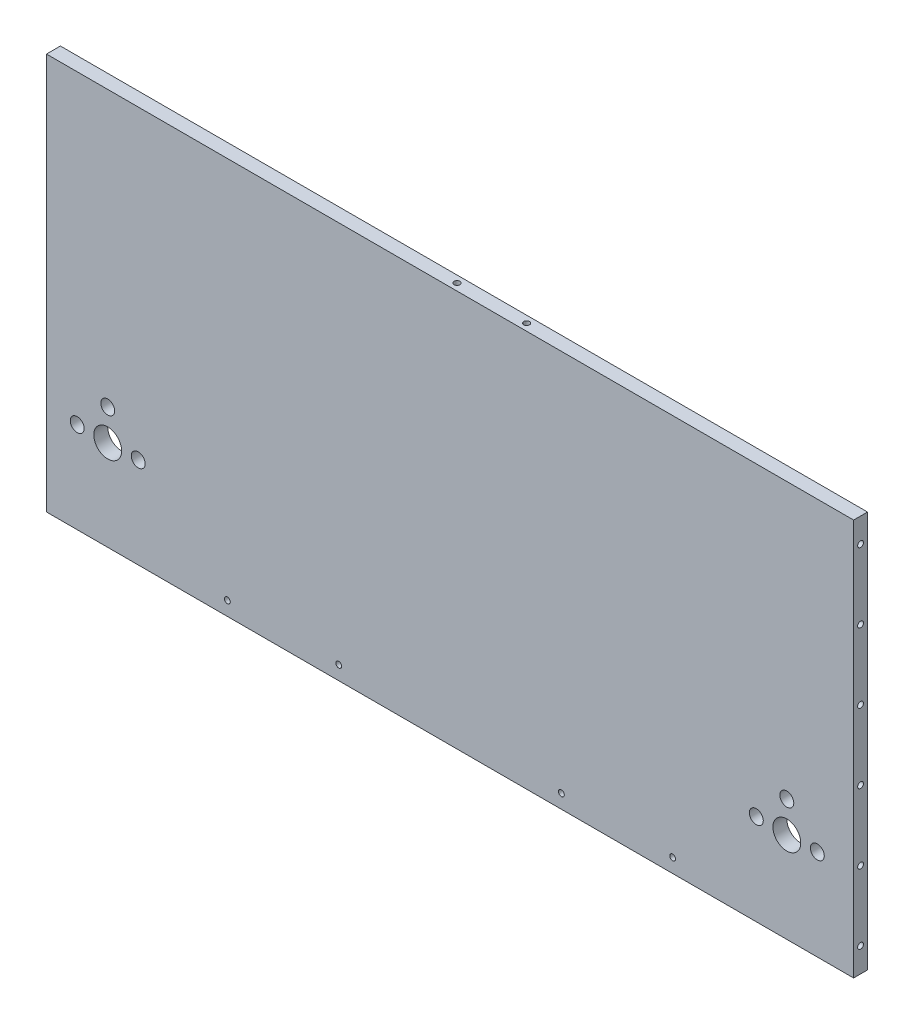
ISO-10303-21;
HEADER;
FILE_DESCRIPTION(('STEP AP214'),'2;1');
FILE_NAME('part.step','',(''),(''),'','','');
FILE_SCHEMA(('AUTOMOTIVE_DESIGN { 1 0 10303 214 1 1 1 1 }'));
ENDSEC;
DATA;
#1=APPLICATION_CONTEXT('core data for automotive mechanical design processes');
#2=APPLICATION_PROTOCOL_DEFINITION('international standard','automotive_design',2000,#1);
#3=PRODUCT_CONTEXT('',#1,'mechanical');
#4=PRODUCT('Part','Part','',(#3));
#5=PRODUCT_RELATED_PRODUCT_CATEGORY('part','',(#4));
#6=PRODUCT_DEFINITION_FORMATION('','',#4);
#7=PRODUCT_DEFINITION_CONTEXT('part definition',#1,'design');
#8=PRODUCT_DEFINITION('design','',#6,#7);
#9=PRODUCT_DEFINITION_SHAPE('','',#8);
#10=(LENGTH_UNIT() NAMED_UNIT(*) SI_UNIT(.MILLI.,.METRE.));
#11=(NAMED_UNIT(*) PLANE_ANGLE_UNIT() SI_UNIT($,.RADIAN.));
#12=(NAMED_UNIT(*) SI_UNIT($,.STERADIAN.) SOLID_ANGLE_UNIT());
#13=UNCERTAINTY_MEASURE_WITH_UNIT(LENGTH_MEASURE(1.E-05),#10,'distance_accuracy_value','');
#14=(GEOMETRIC_REPRESENTATION_CONTEXT(3) GLOBAL_UNCERTAINTY_ASSIGNED_CONTEXT((#13)) GLOBAL_UNIT_ASSIGNED_CONTEXT((#10,
#11,#12)) REPRESENTATION_CONTEXT('',''));
#15=CARTESIAN_POINT('',(0.,0.,0.));
#16=DIRECTION('',(0.,0.,1.));
#17=DIRECTION('',(1.,0.,0.));
#18=AXIS2_PLACEMENT_3D('',#15,#16,#17);
#19=CARTESIAN_POINT('',(290.,142.5,10.));
#20=DIRECTION('',(-1.,0.,0.));
#21=DIRECTION('',(0.,0.,1.));
#22=AXIS2_PLACEMENT_3D('',#19,#20,#21);
#23=PLANE('',#22);
#24=CARTESIAN_POINT('',(290.,125.,5.));
#25=DIRECTION('',(1.,0.,0.));
#26=DIRECTION('',(0.,0.,-1.));
#27=AXIS2_PLACEMENT_3D('',#24,#25,#26);
#28=CIRCLE('',#27,2.1);
#29=CARTESIAN_POINT('',(290.,125.,2.9));
#30=VERTEX_POINT('',#29);
#31=EDGE_CURVE('E137',#30,#30,#28,.T.);
#32=ORIENTED_EDGE('',*,*,#31,.F.);
#33=EDGE_LOOP('',(#32));
#34=FACE_BOUND('',#33,.T.);
#35=CARTESIAN_POINT('',(290.,75.,5.));
#36=DIRECTION('',(1.,0.,0.));
#37=DIRECTION('',(0.,0.,-1.));
#38=AXIS2_PLACEMENT_3D('',#35,#36,#37);
#39=CIRCLE('',#38,2.1);
#40=CARTESIAN_POINT('',(290.,75.,2.9));
#41=VERTEX_POINT('',#40);
#42=EDGE_CURVE('E136',#41,#41,#39,.T.);
#43=ORIENTED_EDGE('',*,*,#42,.F.);
#44=EDGE_LOOP('',(#43));
#45=FACE_BOUND('',#44,.T.);
#46=CARTESIAN_POINT('',(290.,25.,5.));
#47=DIRECTION('',(1.,0.,0.));
#48=DIRECTION('',(0.,0.,-1.));
#49=AXIS2_PLACEMENT_3D('',#46,#47,#48);
#50=CIRCLE('',#49,2.1);
#51=CARTESIAN_POINT('',(290.,25.,2.9));
#52=VERTEX_POINT('',#51);
#53=EDGE_CURVE('E149',#52,#52,#50,.T.);
#54=ORIENTED_EDGE('',*,*,#53,.F.);
#55=EDGE_LOOP('',(#54));
#56=FACE_BOUND('',#55,.T.);
#57=CARTESIAN_POINT('',(290.,-25.0000000000001,5.));
#58=DIRECTION('',(1.,0.,0.));
#59=DIRECTION('',(0.,0.,-1.));
#60=AXIS2_PLACEMENT_3D('',#57,#58,#59);
#61=CIRCLE('',#60,2.1);
#62=CARTESIAN_POINT('',(290.,-25.0000000000001,2.9));
#63=VERTEX_POINT('',#62);
#64=EDGE_CURVE('E155',#63,#63,#61,.T.);
#65=ORIENTED_EDGE('',*,*,#64,.F.);
#66=EDGE_LOOP('',(#65));
#67=FACE_BOUND('',#66,.T.);
#68=CARTESIAN_POINT('',(290.,-75.0000000000001,5.));
#69=DIRECTION('',(1.,0.,0.));
#70=DIRECTION('',(0.,0.,-1.));
#71=AXIS2_PLACEMENT_3D('',#68,#69,#70);
#72=CIRCLE('',#71,2.1);
#73=CARTESIAN_POINT('',(290.,-75.0000000000001,2.9));
#74=VERTEX_POINT('',#73);
#75=EDGE_CURVE('E161',#74,#74,#72,.T.);
#76=ORIENTED_EDGE('',*,*,#75,.F.);
#77=EDGE_LOOP('',(#76));
#78=FACE_BOUND('',#77,.T.);
#79=CARTESIAN_POINT('',(290.,-125.,5.));
#80=DIRECTION('',(1.,0.,0.));
#81=DIRECTION('',(0.,0.,-1.));
#82=AXIS2_PLACEMENT_3D('',#79,#80,#81);
#83=CIRCLE('',#82,2.1);
#84=CARTESIAN_POINT('',(290.,-125.,2.9));
#85=VERTEX_POINT('',#84);
#86=EDGE_CURVE('E167',#85,#85,#83,.T.);
#87=ORIENTED_EDGE('',*,*,#86,.F.);
#88=EDGE_LOOP('',(#87));
#89=FACE_BOUND('',#88,.T.);
#90=DIRECTION('',(0.,1.,0.));
#91=VECTOR('',#90,1.);
#92=CARTESIAN_POINT('',(290.,142.5,0.));
#93=LINE('',#92,#91);
#94=CARTESIAN_POINT('',(290.,-142.5,0.));
#95=VERTEX_POINT('',#94);
#96=CARTESIAN_POINT('',(290.,142.5,0.));
#97=VERTEX_POINT('',#96);
#98=EDGE_CURVE('E209',#95,#97,#93,.T.);
#99=ORIENTED_EDGE('',*,*,#98,.T.);
#100=DIRECTION('',(0.,0.,-1.));
#101=VECTOR('',#100,1.);
#102=CARTESIAN_POINT('',(290.,142.5,10.));
#103=LINE('',#102,#101);
#104=CARTESIAN_POINT('',(290.,142.5,10.));
#105=VERTEX_POINT('',#104);
#106=EDGE_CURVE('E11',#105,#97,#103,.T.);
#107=ORIENTED_EDGE('',*,*,#106,.F.);
#108=DIRECTION('',(0.,1.,0.));
#109=VECTOR('',#108,1.);
#110=CARTESIAN_POINT('',(290.,142.5,10.));
#111=LINE('',#110,#109);
#112=CARTESIAN_POINT('',(290.,-142.5,10.));
#113=VERTEX_POINT('',#112);
#114=EDGE_CURVE('E210',#113,#105,#111,.T.);
#115=ORIENTED_EDGE('',*,*,#114,.F.);
#116=DIRECTION('',(0.,0.,-1.));
#117=VECTOR('',#116,1.);
#118=CARTESIAN_POINT('',(290.,-142.5,10.));
#119=LINE('',#118,#117);
#120=EDGE_CURVE('E216',#113,#95,#119,.T.);
#121=ORIENTED_EDGE('',*,*,#120,.T.);
#122=EDGE_LOOP('',(#99,#107,#115,#121));
#123=FACE_BOUND('',#122,.T.);
#124=ADVANCED_FACE('F42',(#34,#45,#56,#67,#78,#89,#123),#23,.F.);
#125=CARTESIAN_POINT('',(-290.,142.5,10.));
#126=DIRECTION('',(0.,-1.,0.));
#127=DIRECTION('',(0.,0.,-1.));
#128=AXIS2_PLACEMENT_3D('',#125,#126,#127);
#129=PLANE('',#128);
#130=CARTESIAN_POINT('',(0.,142.5,5.));
#131=DIRECTION('',(0.,-1.,0.));
#132=DIRECTION('',(0.,0.,-1.));
#133=AXIS2_PLACEMENT_3D('',#130,#131,#132);
#134=CIRCLE('',#133,2.09999999999996);
#135=CARTESIAN_POINT('',(0.,142.5,2.90000000000004));
#136=VERTEX_POINT('',#135);
#137=EDGE_CURVE('E391',#136,#136,#134,.T.);
#138=ORIENTED_EDGE('',*,*,#137,.T.);
#139=EDGE_LOOP('',(#138));
#140=FACE_BOUND('',#139,.T.);
#141=CARTESIAN_POINT('',(50.,142.5,5.0000000000007));
#142=DIRECTION('',(0.,-1.,0.));
#143=DIRECTION('',(0.,0.,-1.));
#144=AXIS2_PLACEMENT_3D('',#141,#142,#143);
#145=CIRCLE('',#144,2.09999999999996);
#146=CARTESIAN_POINT('',(50.,142.5,2.90000000000074));
#147=VERTEX_POINT('',#146);
#148=EDGE_CURVE('E143',#147,#147,#145,.T.);
#149=ORIENTED_EDGE('',*,*,#148,.T.);
#150=EDGE_LOOP('',(#149));
#151=FACE_BOUND('',#150,.T.);
#152=DIRECTION('',(-1.,0.,0.));
#153=VECTOR('',#152,1.);
#154=CARTESIAN_POINT('',(-290.,142.5,0.));
#155=LINE('',#154,#153);
#156=CARTESIAN_POINT('',(-290.,142.5,0.));
#157=VERTEX_POINT('',#156);
#158=EDGE_CURVE('E219',#97,#157,#155,.T.);
#159=ORIENTED_EDGE('',*,*,#158,.T.);
#160=DIRECTION('',(0.,0.,-1.));
#161=VECTOR('',#160,1.);
#162=CARTESIAN_POINT('',(-290.,142.5,10.));
#163=LINE('',#162,#161);
#164=CARTESIAN_POINT('',(-290.,142.5,10.));
#165=VERTEX_POINT('',#164);
#166=EDGE_CURVE('E50',#165,#157,#163,.T.);
#167=ORIENTED_EDGE('',*,*,#166,.F.);
#168=DIRECTION('',(-1.,0.,0.));
#169=VECTOR('',#168,1.);
#170=CARTESIAN_POINT('',(-290.,142.5,10.));
#171=LINE('',#170,#169);
#172=EDGE_CURVE('E89',#105,#165,#171,.T.);
#173=ORIENTED_EDGE('',*,*,#172,.F.);
#174=ORIENTED_EDGE('',*,*,#106,.T.);
#175=EDGE_LOOP('',(#159,#167,#173,#174));
#176=FACE_BOUND('',#175,.T.);
#177=ADVANCED_FACE('F245',(#140,#151,#176),#129,.F.);
#178=CARTESIAN_POINT('',(-290.,142.5,10.));
#179=DIRECTION('',(1.,0.,0.));
#180=DIRECTION('',(0.,0.,-1.));
#181=AXIS2_PLACEMENT_3D('',#178,#179,#180);
#182=PLANE('',#181);
#183=CARTESIAN_POINT('',(-290.,125.,5.));
#184=DIRECTION('',(-1.,0.,0.));
#185=DIRECTION('',(0.,0.,1.));
#186=AXIS2_PLACEMENT_3D('',#183,#184,#185);
#187=CIRCLE('',#186,2.1);
#188=CARTESIAN_POINT('',(-290.,125.,7.1));
#189=VERTEX_POINT('',#188);
#190=EDGE_CURVE('E173',#189,#189,#187,.T.);
#191=ORIENTED_EDGE('',*,*,#190,.F.);
#192=EDGE_LOOP('',(#191));
#193=FACE_BOUND('',#192,.T.);
#194=CARTESIAN_POINT('',(-290.,75.,5.));
#195=DIRECTION('',(-1.,0.,0.));
#196=DIRECTION('',(0.,0.,1.));
#197=AXIS2_PLACEMENT_3D('',#194,#195,#196);
#198=CIRCLE('',#197,2.1);
#199=CARTESIAN_POINT('',(-290.,75.,7.1));
#200=VERTEX_POINT('',#199);
#201=EDGE_CURVE('E179',#200,#200,#198,.T.);
#202=ORIENTED_EDGE('',*,*,#201,.F.);
#203=EDGE_LOOP('',(#202));
#204=FACE_BOUND('',#203,.T.);
#205=CARTESIAN_POINT('',(-290.,25.,5.));
#206=DIRECTION('',(-1.,0.,0.));
#207=DIRECTION('',(0.,0.,1.));
#208=AXIS2_PLACEMENT_3D('',#205,#206,#207);
#209=CIRCLE('',#208,2.1);
#210=CARTESIAN_POINT('',(-290.,25.,7.1));
#211=VERTEX_POINT('',#210);
#212=EDGE_CURVE('E185',#211,#211,#209,.T.);
#213=ORIENTED_EDGE('',*,*,#212,.F.);
#214=EDGE_LOOP('',(#213));
#215=FACE_BOUND('',#214,.T.);
#216=CARTESIAN_POINT('',(-290.,-25.0000000000001,5.));
#217=DIRECTION('',(-1.,0.,0.));
#218=DIRECTION('',(0.,0.,1.));
#219=AXIS2_PLACEMENT_3D('',#216,#217,#218);
#220=CIRCLE('',#219,2.1);
#221=CARTESIAN_POINT('',(-290.,-25.0000000000001,7.1));
#222=VERTEX_POINT('',#221);
#223=EDGE_CURVE('E191',#222,#222,#220,.T.);
#224=ORIENTED_EDGE('',*,*,#223,.F.);
#225=EDGE_LOOP('',(#224));
#226=FACE_BOUND('',#225,.T.);
#227=CARTESIAN_POINT('',(-290.,-75.0000000000001,5.));
#228=DIRECTION('',(-1.,0.,0.));
#229=DIRECTION('',(0.,0.,1.));
#230=AXIS2_PLACEMENT_3D('',#227,#228,#229);
#231=CIRCLE('',#230,2.1);
#232=CARTESIAN_POINT('',(-290.,-75.0000000000001,7.1));
#233=VERTEX_POINT('',#232);
#234=EDGE_CURVE('E197',#233,#233,#231,.T.);
#235=ORIENTED_EDGE('',*,*,#234,.F.);
#236=EDGE_LOOP('',(#235));
#237=FACE_BOUND('',#236,.T.);
#238=CARTESIAN_POINT('',(-290.,-125.,5.));
#239=DIRECTION('',(-1.,0.,0.));
#240=DIRECTION('',(0.,0.,1.));
#241=AXIS2_PLACEMENT_3D('',#238,#239,#240);
#242=CIRCLE('',#241,2.1);
#243=CARTESIAN_POINT('',(-290.,-125.,7.1));
#244=VERTEX_POINT('',#243);
#245=EDGE_CURVE('E203',#244,#244,#242,.T.);
#246=ORIENTED_EDGE('',*,*,#245,.F.);
#247=EDGE_LOOP('',(#246));
#248=FACE_BOUND('',#247,.T.);
#249=DIRECTION('',(0.,-1.,0.));
#250=VECTOR('',#249,1.);
#251=CARTESIAN_POINT('',(-290.,142.5,0.));
#252=LINE('',#251,#250);
#253=CARTESIAN_POINT('',(-290.,-142.5,0.));
#254=VERTEX_POINT('',#253);
#255=EDGE_CURVE('E76',#157,#254,#252,.T.);
#256=ORIENTED_EDGE('',*,*,#255,.T.);
#257=DIRECTION('',(0.,0.,-1.));
#258=VECTOR('',#257,1.);
#259=CARTESIAN_POINT('',(-290.,-142.5,10.));
#260=LINE('',#259,#258);
#261=CARTESIAN_POINT('',(-290.,-142.5,10.));
#262=VERTEX_POINT('',#261);
#263=EDGE_CURVE('E224',#262,#254,#260,.T.);
#264=ORIENTED_EDGE('',*,*,#263,.F.);
#265=DIRECTION('',(0.,-1.,0.));
#266=VECTOR('',#265,1.);
#267=CARTESIAN_POINT('',(-290.,142.5,10.));
#268=LINE('',#267,#266);
#269=EDGE_CURVE('E213',#165,#262,#268,.T.);
#270=ORIENTED_EDGE('',*,*,#269,.F.);
#271=ORIENTED_EDGE('',*,*,#166,.T.);
#272=EDGE_LOOP('',(#256,#264,#270,#271));
#273=FACE_BOUND('',#272,.T.);
#274=ADVANCED_FACE('F226',(#193,#204,#215,#226,#237,#248,#273),#182,.F.);
#275=CARTESIAN_POINT('',(-290.,-142.5,10.));
#276=DIRECTION('',(0.,1.,0.));
#277=DIRECTION('',(0.,0.,1.));
#278=AXIS2_PLACEMENT_3D('',#275,#276,#277);
#279=PLANE('',#278);
#280=CARTESIAN_POINT('',(0.,-142.5,5.));
#281=DIRECTION('',(0.,-1.,0.));
#282=DIRECTION('',(0.,0.,-1.));
#283=AXIS2_PLACEMENT_3D('',#280,#281,#282);
#284=CIRCLE('',#283,2.09999999999999);
#285=CARTESIAN_POINT('',(0.,-142.5,2.90000000000001));
#286=VERTEX_POINT('',#285);
#287=EDGE_CURVE('E387',#286,#286,#284,.T.);
#288=ORIENTED_EDGE('',*,*,#287,.F.);
#289=EDGE_LOOP('',(#288));
#290=FACE_BOUND('',#289,.T.);
#291=CARTESIAN_POINT('',(50.,-142.5,5.0000000000007));
#292=DIRECTION('',(0.,-1.,0.));
#293=DIRECTION('',(0.,0.,-1.));
#294=AXIS2_PLACEMENT_3D('',#291,#292,#293);
#295=CIRCLE('',#294,2.09999999999999);
#296=CARTESIAN_POINT('',(50.,-142.5,2.90000000000071));
#297=VERTEX_POINT('',#296);
#298=EDGE_CURVE('E399',#297,#297,#295,.T.);
#299=ORIENTED_EDGE('',*,*,#298,.F.);
#300=EDGE_LOOP('',(#299));
#301=FACE_BOUND('',#300,.T.);
#302=DIRECTION('',(1.,0.,0.));
#303=VECTOR('',#302,1.);
#304=CARTESIAN_POINT('',(-290.,-142.5,0.));
#305=LINE('',#304,#303);
#306=EDGE_CURVE('E82',#254,#95,#305,.T.);
#307=ORIENTED_EDGE('',*,*,#306,.T.);
#308=ORIENTED_EDGE('',*,*,#120,.F.);
#309=DIRECTION('',(1.,0.,0.));
#310=VECTOR('',#309,1.);
#311=CARTESIAN_POINT('',(-290.,-142.5,10.));
#312=LINE('',#311,#310);
#313=EDGE_CURVE('E58',#262,#113,#312,.T.);
#314=ORIENTED_EDGE('',*,*,#313,.F.);
#315=ORIENTED_EDGE('',*,*,#263,.T.);
#316=EDGE_LOOP('',(#307,#308,#314,#315));
#317=FACE_BOUND('',#316,.T.);
#318=ADVANCED_FACE('F233',(#290,#301,#317),#279,.F.);
#319=CARTESIAN_POINT('',(0.,0.,10.));
#320=DIRECTION('',(0.,0.,1.));
#321=DIRECTION('',(1.,0.,0.));
#322=AXIS2_PLACEMENT_3D('',#319,#320,#321);
#323=PLANE('',#322);
#324=CARTESIAN_POINT('',(242.,-77.5,10.));
#325=DIRECTION('',(0.,0.,-1.));
#326=DIRECTION('',(-1.,0.,0.));
#327=AXIS2_PLACEMENT_3D('',#324,#325,#326);
#328=CIRCLE('',#327,10.);
#329=CARTESIAN_POINT('',(232.,-77.5,10.));
#330=VERTEX_POINT('',#329);
#331=EDGE_CURVE('E928',#330,#330,#328,.T.);
#332=ORIENTED_EDGE('',*,*,#331,.T.);
#333=EDGE_LOOP('',(#332));
#334=FACE_BOUND('',#333,.T.);
#335=CARTESIAN_POINT('',(-246.,-77.5,10.));
#336=DIRECTION('',(0.,0.,1.));
#337=DIRECTION('',(1.,0.,0.));
#338=AXIS2_PLACEMENT_3D('',#335,#336,#337);
#339=CIRCLE('',#338,10.);
#340=CARTESIAN_POINT('',(-236.,-77.5,10.));
#341=VERTEX_POINT('',#340);
#342=EDGE_CURVE('E930',#341,#341,#339,.T.);
#343=ORIENTED_EDGE('',*,*,#342,.F.);
#344=EDGE_LOOP('',(#343));
#345=FACE_BOUND('',#344,.T.);
#346=CARTESIAN_POINT('',(263.92,-77.07,10.));
#347=DIRECTION('',(0.,0.,-1.));
#348=DIRECTION('',(-1.,0.,0.));
#349=AXIS2_PLACEMENT_3D('',#346,#347,#348);
#350=CIRCLE('',#349,4.99999999999999);
#351=CARTESIAN_POINT('',(258.92,-77.07,10.));
#352=VERTEX_POINT('',#351);
#353=EDGE_CURVE('E938',#352,#352,#350,.T.);
#354=ORIENTED_EDGE('',*,*,#353,.T.);
#355=EDGE_LOOP('',(#354));
#356=FACE_BOUND('',#355,.T.);
#357=CARTESIAN_POINT('',(220.08,-77.07,10.));
#358=DIRECTION('',(0.,0.,-1.));
#359=DIRECTION('',(-1.,0.,0.));
#360=AXIS2_PLACEMENT_3D('',#357,#358,#359);
#361=CIRCLE('',#360,4.99999999999999);
#362=CARTESIAN_POINT('',(215.08,-77.07,10.));
#363=VERTEX_POINT('',#362);
#364=EDGE_CURVE('E942',#363,#363,#361,.T.);
#365=ORIENTED_EDGE('',*,*,#364,.T.);
#366=EDGE_LOOP('',(#365));
#367=FACE_BOUND('',#366,.T.);
#368=CARTESIAN_POINT('',(242.,-55.15,10.));
#369=DIRECTION('',(0.,0.,-1.));
#370=DIRECTION('',(-1.,0.,0.));
#371=AXIS2_PLACEMENT_3D('',#368,#369,#370);
#372=CIRCLE('',#371,4.99999999999999);
#373=CARTESIAN_POINT('',(237.,-55.15,10.));
#374=VERTEX_POINT('',#373);
#375=EDGE_CURVE('E934',#374,#374,#372,.T.);
#376=ORIENTED_EDGE('',*,*,#375,.T.);
#377=EDGE_LOOP('',(#376));
#378=FACE_BOUND('',#377,.T.);
#379=CARTESIAN_POINT('',(-267.92,-77.07,10.));
#380=DIRECTION('',(0.,0.,1.));
#381=DIRECTION('',(1.,0.,0.));
#382=AXIS2_PLACEMENT_3D('',#379,#380,#381);
#383=CIRCLE('',#382,4.99999999999999);
#384=CARTESIAN_POINT('',(-262.92,-77.07,10.));
#385=VERTEX_POINT('',#384);
#386=EDGE_CURVE('E950',#385,#385,#383,.T.);
#387=ORIENTED_EDGE('',*,*,#386,.F.);
#388=EDGE_LOOP('',(#387));
#389=FACE_BOUND('',#388,.T.);
#390=CARTESIAN_POINT('',(-224.08,-77.07,10.));
#391=DIRECTION('',(0.,0.,1.));
#392=DIRECTION('',(1.,0.,0.));
#393=AXIS2_PLACEMENT_3D('',#390,#391,#392);
#394=CIRCLE('',#393,4.99999999999999);
#395=CARTESIAN_POINT('',(-219.08,-77.07,10.));
#396=VERTEX_POINT('',#395);
#397=EDGE_CURVE('E953',#396,#396,#394,.T.);
#398=ORIENTED_EDGE('',*,*,#397,.F.);
#399=EDGE_LOOP('',(#398));
#400=FACE_BOUND('',#399,.T.);
#401=CARTESIAN_POINT('',(-246.,-55.15,10.));
#402=DIRECTION('',(0.,0.,1.));
#403=DIRECTION('',(1.,0.,0.));
#404=AXIS2_PLACEMENT_3D('',#401,#402,#403);
#405=CIRCLE('',#404,4.99999999999999);
#406=CARTESIAN_POINT('',(-241.,-55.15,10.));
#407=VERTEX_POINT('',#406);
#408=EDGE_CURVE('E957',#407,#407,#405,.T.);
#409=ORIENTED_EDGE('',*,*,#408,.F.);
#410=EDGE_LOOP('',(#409));
#411=FACE_BOUND('',#410,.T.);
#412=CARTESIAN_POINT('',(-160.,-132.5,10.));
#413=DIRECTION('',(0.,0.,1.));
#414=DIRECTION('',(1.,0.,0.));
#415=AXIS2_PLACEMENT_3D('',#412,#413,#414);
#416=CIRCLE('',#415,2.09999999999999);
#417=CARTESIAN_POINT('',(-157.9,-132.5,10.));
#418=VERTEX_POINT('',#417);
#419=EDGE_CURVE('E949',#418,#418,#416,.T.);
#420=ORIENTED_EDGE('',*,*,#419,.F.);
#421=EDGE_LOOP('',(#420));
#422=FACE_BOUND('',#421,.T.);
#423=CARTESIAN_POINT('',(-80.,-132.5,10.));
#424=DIRECTION('',(0.,0.,1.));
#425=DIRECTION('',(1.,0.,0.));
#426=AXIS2_PLACEMENT_3D('',#423,#424,#425);
#427=CIRCLE('',#426,2.09999999999999);
#428=CARTESIAN_POINT('',(-77.9,-132.5,10.));
#429=VERTEX_POINT('',#428);
#430=EDGE_CURVE('E964',#429,#429,#427,.T.);
#431=ORIENTED_EDGE('',*,*,#430,.F.);
#432=EDGE_LOOP('',(#431));
#433=FACE_BOUND('',#432,.T.);
#434=CARTESIAN_POINT('',(80.,-132.5,10.));
#435=DIRECTION('',(0.,0.,1.));
#436=DIRECTION('',(1.,0.,0.));
#437=AXIS2_PLACEMENT_3D('',#434,#435,#436);
#438=CIRCLE('',#437,2.09999999999999);
#439=CARTESIAN_POINT('',(82.1,-132.5,10.));
#440=VERTEX_POINT('',#439);
#441=EDGE_CURVE('E968',#440,#440,#438,.T.);
#442=ORIENTED_EDGE('',*,*,#441,.F.);
#443=EDGE_LOOP('',(#442));
#444=FACE_BOUND('',#443,.T.);
#445=CARTESIAN_POINT('',(160.,-132.5,10.));
#446=DIRECTION('',(0.,0.,1.));
#447=DIRECTION('',(1.,0.,0.));
#448=AXIS2_PLACEMENT_3D('',#445,#446,#447);
#449=CIRCLE('',#448,2.09999999999999);
#450=CARTESIAN_POINT('',(162.1,-132.5,10.));
#451=VERTEX_POINT('',#450);
#452=EDGE_CURVE('E388',#451,#451,#449,.T.);
#453=ORIENTED_EDGE('',*,*,#452,.F.);
#454=EDGE_LOOP('',(#453));
#455=FACE_BOUND('',#454,.T.);
#456=ORIENTED_EDGE('',*,*,#114,.T.);
#457=ORIENTED_EDGE('',*,*,#172,.T.);
#458=ORIENTED_EDGE('',*,*,#269,.T.);
#459=ORIENTED_EDGE('',*,*,#313,.T.);
#460=EDGE_LOOP('',(#456,#457,#458,#459));
#461=FACE_BOUND('',#460,.T.);
#462=ADVANCED_FACE('F235',(#334,#345,#356,#367,#378,#389,#400,#411,#422,#433,#444,#455,#461),
#323,.T.);
#463=CARTESIAN_POINT('',(0.,0.,0.));
#464=DIRECTION('',(0.,0.,1.));
#465=DIRECTION('',(1.,0.,0.));
#466=AXIS2_PLACEMENT_3D('',#463,#464,#465);
#467=PLANE('',#466);
#468=CARTESIAN_POINT('',(242.,-77.5,0.));
#469=DIRECTION('',(0.,0.,-1.));
#470=DIRECTION('',(-1.,0.,0.));
#471=AXIS2_PLACEMENT_3D('',#468,#469,#470);
#472=CIRCLE('',#471,10.);
#473=CARTESIAN_POINT('',(232.,-77.5,0.));
#474=VERTEX_POINT('',#473);
#475=EDGE_CURVE('E342',#474,#474,#472,.T.);
#476=ORIENTED_EDGE('',*,*,#475,.F.);
#477=EDGE_LOOP('',(#476));
#478=FACE_BOUND('',#477,.T.);
#479=CARTESIAN_POINT('',(-246.,-77.5,0.));
#480=DIRECTION('',(0.,0.,1.));
#481=DIRECTION('',(1.,0.,0.));
#482=AXIS2_PLACEMENT_3D('',#479,#480,#481);
#483=CIRCLE('',#482,10.);
#484=CARTESIAN_POINT('',(-236.,-77.5,0.));
#485=VERTEX_POINT('',#484);
#486=EDGE_CURVE('E346',#485,#485,#483,.T.);
#487=ORIENTED_EDGE('',*,*,#486,.T.);
#488=EDGE_LOOP('',(#487));
#489=FACE_BOUND('',#488,.T.);
#490=CARTESIAN_POINT('',(263.92,-77.07,0.));
#491=DIRECTION('',(0.,0.,-1.));
#492=DIRECTION('',(-1.,0.,0.));
#493=AXIS2_PLACEMENT_3D('',#490,#491,#492);
#494=CIRCLE('',#493,4.99999999999999);
#495=CARTESIAN_POINT('',(258.92,-77.07,0.));
#496=VERTEX_POINT('',#495);
#497=EDGE_CURVE('E350',#496,#496,#494,.T.);
#498=ORIENTED_EDGE('',*,*,#497,.F.);
#499=EDGE_LOOP('',(#498));
#500=FACE_BOUND('',#499,.T.);
#501=CARTESIAN_POINT('',(220.08,-77.07,0.));
#502=DIRECTION('',(0.,0.,-1.));
#503=DIRECTION('',(-1.,0.,0.));
#504=AXIS2_PLACEMENT_3D('',#501,#502,#503);
#505=CIRCLE('',#504,4.99999999999999);
#506=CARTESIAN_POINT('',(215.08,-77.07,0.));
#507=VERTEX_POINT('',#506);
#508=EDGE_CURVE('E354',#507,#507,#505,.T.);
#509=ORIENTED_EDGE('',*,*,#508,.F.);
#510=EDGE_LOOP('',(#509));
#511=FACE_BOUND('',#510,.T.);
#512=CARTESIAN_POINT('',(242.,-55.15,0.));
#513=DIRECTION('',(0.,0.,-1.));
#514=DIRECTION('',(-1.,0.,0.));
#515=AXIS2_PLACEMENT_3D('',#512,#513,#514);
#516=CIRCLE('',#515,4.99999999999999);
#517=CARTESIAN_POINT('',(237.,-55.15,0.));
#518=VERTEX_POINT('',#517);
#519=EDGE_CURVE('E358',#518,#518,#516,.T.);
#520=ORIENTED_EDGE('',*,*,#519,.F.);
#521=EDGE_LOOP('',(#520));
#522=FACE_BOUND('',#521,.T.);
#523=CARTESIAN_POINT('',(-267.92,-77.07,0.));
#524=DIRECTION('',(0.,0.,1.));
#525=DIRECTION('',(1.,0.,0.));
#526=AXIS2_PLACEMENT_3D('',#523,#524,#525);
#527=CIRCLE('',#526,4.99999999999999);
#528=CARTESIAN_POINT('',(-262.92,-77.07,0.));
#529=VERTEX_POINT('',#528);
#530=EDGE_CURVE('E362',#529,#529,#527,.T.);
#531=ORIENTED_EDGE('',*,*,#530,.T.);
#532=EDGE_LOOP('',(#531));
#533=FACE_BOUND('',#532,.T.);
#534=CARTESIAN_POINT('',(-224.08,-77.07,0.));
#535=DIRECTION('',(0.,0.,1.));
#536=DIRECTION('',(1.,0.,0.));
#537=AXIS2_PLACEMENT_3D('',#534,#535,#536);
#538=CIRCLE('',#537,4.99999999999999);
#539=CARTESIAN_POINT('',(-219.08,-77.07,0.));
#540=VERTEX_POINT('',#539);
#541=EDGE_CURVE('E366',#540,#540,#538,.T.);
#542=ORIENTED_EDGE('',*,*,#541,.T.);
#543=EDGE_LOOP('',(#542));
#544=FACE_BOUND('',#543,.T.);
#545=CARTESIAN_POINT('',(-246.,-55.15,0.));
#546=DIRECTION('',(0.,0.,1.));
#547=DIRECTION('',(1.,0.,0.));
#548=AXIS2_PLACEMENT_3D('',#545,#546,#547);
#549=CIRCLE('',#548,4.99999999999999);
#550=CARTESIAN_POINT('',(-241.,-55.15,0.));
#551=VERTEX_POINT('',#550);
#552=EDGE_CURVE('E370',#551,#551,#549,.T.);
#553=ORIENTED_EDGE('',*,*,#552,.T.);
#554=EDGE_LOOP('',(#553));
#555=FACE_BOUND('',#554,.T.);
#556=CARTESIAN_POINT('',(-160.,-132.5,0.));
#557=DIRECTION('',(0.,0.,1.));
#558=DIRECTION('',(1.,0.,0.));
#559=AXIS2_PLACEMENT_3D('',#556,#557,#558);
#560=CIRCLE('',#559,2.09999999999999);
#561=CARTESIAN_POINT('',(-157.9,-132.5,0.));
#562=VERTEX_POINT('',#561);
#563=EDGE_CURVE('E374',#562,#562,#560,.T.);
#564=ORIENTED_EDGE('',*,*,#563,.T.);
#565=EDGE_LOOP('',(#564));
#566=FACE_BOUND('',#565,.T.);
#567=CARTESIAN_POINT('',(-80.,-132.5,0.));
#568=DIRECTION('',(0.,0.,1.));
#569=DIRECTION('',(1.,0.,0.));
#570=AXIS2_PLACEMENT_3D('',#567,#568,#569);
#571=CIRCLE('',#570,2.09999999999999);
#572=CARTESIAN_POINT('',(-77.9,-132.5,0.));
#573=VERTEX_POINT('',#572);
#574=EDGE_CURVE('E378',#573,#573,#571,.T.);
#575=ORIENTED_EDGE('',*,*,#574,.T.);
#576=EDGE_LOOP('',(#575));
#577=FACE_BOUND('',#576,.T.);
#578=CARTESIAN_POINT('',(80.,-132.5,0.));
#579=DIRECTION('',(0.,0.,1.));
#580=DIRECTION('',(1.,0.,0.));
#581=AXIS2_PLACEMENT_3D('',#578,#579,#580);
#582=CIRCLE('',#581,2.09999999999999);
#583=CARTESIAN_POINT('',(82.1,-132.5,0.));
#584=VERTEX_POINT('',#583);
#585=EDGE_CURVE('E382',#584,#584,#582,.T.);
#586=ORIENTED_EDGE('',*,*,#585,.T.);
#587=EDGE_LOOP('',(#586));
#588=FACE_BOUND('',#587,.T.);
#589=CARTESIAN_POINT('',(160.,-132.5,0.));
#590=DIRECTION('',(0.,0.,1.));
#591=DIRECTION('',(1.,0.,0.));
#592=AXIS2_PLACEMENT_3D('',#589,#590,#591);
#593=CIRCLE('',#592,2.09999999999999);
#594=CARTESIAN_POINT('',(162.1,-132.5,0.));
#595=VERTEX_POINT('',#594);
#596=EDGE_CURVE('E385',#595,#595,#593,.T.);
#597=ORIENTED_EDGE('',*,*,#596,.T.);
#598=EDGE_LOOP('',(#597));
#599=FACE_BOUND('',#598,.T.);
#600=ORIENTED_EDGE('',*,*,#98,.F.);
#601=ORIENTED_EDGE('',*,*,#306,.F.);
#602=ORIENTED_EDGE('',*,*,#255,.F.);
#603=ORIENTED_EDGE('',*,*,#158,.F.);
#604=EDGE_LOOP('',(#600,#601,#602,#603));
#605=FACE_BOUND('',#604,.T.);
#606=ADVANCED_FACE('F229',(#478,#489,#500,#511,#522,#533,#544,#555,#566,#577,#588,#599,#605),
#467,.F.);
#607=CARTESIAN_POINT('',(-276.,-125.,5.));
#608=DIRECTION('',(-1.,0.,0.));
#609=DIRECTION('',(0.,0.,1.));
#610=AXIS2_PLACEMENT_3D('',#607,#608,#609);
#611=CONICAL_SURFACE('',#610,2.1,1.02974425867667);
#612=CARTESIAN_POINT('',(-274.738192700042,-125.,5.));
#613=VERTEX_POINT('',#612);
#614=VERTEX_LOOP('',#613);
#615=FACE_BOUND('',#614,.T.);
#616=CARTESIAN_POINT('',(-276.,-125.,5.));
#617=DIRECTION('',(-1.,0.,0.));
#618=DIRECTION('',(0.,0.,1.));
#619=AXIS2_PLACEMENT_3D('',#616,#617,#618);
#620=CIRCLE('',#619,2.1);
#621=CARTESIAN_POINT('',(-276.,-125.,7.1));
#622=VERTEX_POINT('',#621);
#623=EDGE_CURVE('E206',#622,#622,#620,.T.);
#624=ORIENTED_EDGE('',*,*,#623,.T.);
#625=EDGE_LOOP('',(#624));
#626=FACE_BOUND('',#625,.T.);
#627=ADVANCED_FACE('F330',(#615,#626),#611,.F.);
#628=CARTESIAN_POINT('',(-290.,-125.,5.));
#629=DIRECTION('',(-1.,0.,0.));
#630=DIRECTION('',(0.,0.,1.));
#631=AXIS2_PLACEMENT_3D('',#628,#629,#630);
#632=CYLINDRICAL_SURFACE('',#631,2.1);
#633=ORIENTED_EDGE('',*,*,#623,.F.);
#634=EDGE_LOOP('',(#633));
#635=FACE_BOUND('',#634,.T.);
#636=ORIENTED_EDGE('',*,*,#245,.T.);
#637=EDGE_LOOP('',(#636));
#638=FACE_BOUND('',#637,.T.);
#639=ADVANCED_FACE('F326',(#635,#638),#632,.F.);
#640=CARTESIAN_POINT('',(-276.,-75.0000000000001,5.));
#641=DIRECTION('',(-1.,0.,0.));
#642=DIRECTION('',(0.,0.,1.));
#643=AXIS2_PLACEMENT_3D('',#640,#641,#642);
#644=CONICAL_SURFACE('',#643,2.1,1.02974425867667);
#645=CARTESIAN_POINT('',(-274.738192700042,-75.0000000000001,5.));
#646=VERTEX_POINT('',#645);
#647=VERTEX_LOOP('',#646);
#648=FACE_BOUND('',#647,.T.);
#649=CARTESIAN_POINT('',(-276.,-75.0000000000001,5.));
#650=DIRECTION('',(-1.,0.,0.));
#651=DIRECTION('',(0.,0.,1.));
#652=AXIS2_PLACEMENT_3D('',#649,#650,#651);
#653=CIRCLE('',#652,2.1);
#654=CARTESIAN_POINT('',(-276.,-75.0000000000001,7.1));
#655=VERTEX_POINT('',#654);
#656=EDGE_CURVE('E200',#655,#655,#653,.T.);
#657=ORIENTED_EDGE('',*,*,#656,.T.);
#658=EDGE_LOOP('',(#657));
#659=FACE_BOUND('',#658,.T.);
#660=ADVANCED_FACE('F322',(#648,#659),#644,.F.);
#661=CARTESIAN_POINT('',(-290.,-75.0000000000001,5.));
#662=DIRECTION('',(-1.,0.,0.));
#663=DIRECTION('',(0.,0.,1.));
#664=AXIS2_PLACEMENT_3D('',#661,#662,#663);
#665=CYLINDRICAL_SURFACE('',#664,2.1);
#666=ORIENTED_EDGE('',*,*,#656,.F.);
#667=EDGE_LOOP('',(#666));
#668=FACE_BOUND('',#667,.T.);
#669=ORIENTED_EDGE('',*,*,#234,.T.);
#670=EDGE_LOOP('',(#669));
#671=FACE_BOUND('',#670,.T.);
#672=ADVANCED_FACE('F318',(#668,#671),#665,.F.);
#673=CARTESIAN_POINT('',(-276.,-25.0000000000001,5.));
#674=DIRECTION('',(-1.,0.,0.));
#675=DIRECTION('',(0.,0.,1.));
#676=AXIS2_PLACEMENT_3D('',#673,#674,#675);
#677=CONICAL_SURFACE('',#676,2.1,1.02974425867667);
#678=CARTESIAN_POINT('',(-274.738192700042,-25.0000000000001,5.));
#679=VERTEX_POINT('',#678);
#680=VERTEX_LOOP('',#679);
#681=FACE_BOUND('',#680,.T.);
#682=CARTESIAN_POINT('',(-276.,-25.0000000000001,5.));
#683=DIRECTION('',(-1.,0.,0.));
#684=DIRECTION('',(0.,0.,1.));
#685=AXIS2_PLACEMENT_3D('',#682,#683,#684);
#686=CIRCLE('',#685,2.1);
#687=CARTESIAN_POINT('',(-276.,-25.0000000000001,7.1));
#688=VERTEX_POINT('',#687);
#689=EDGE_CURVE('E194',#688,#688,#686,.T.);
#690=ORIENTED_EDGE('',*,*,#689,.T.);
#691=EDGE_LOOP('',(#690));
#692=FACE_BOUND('',#691,.T.);
#693=ADVANCED_FACE('F314',(#681,#692),#677,.F.);
#694=CARTESIAN_POINT('',(-290.,-25.0000000000001,5.));
#695=DIRECTION('',(-1.,0.,0.));
#696=DIRECTION('',(0.,0.,1.));
#697=AXIS2_PLACEMENT_3D('',#694,#695,#696);
#698=CYLINDRICAL_SURFACE('',#697,2.1);
#699=ORIENTED_EDGE('',*,*,#689,.F.);
#700=EDGE_LOOP('',(#699));
#701=FACE_BOUND('',#700,.T.);
#702=ORIENTED_EDGE('',*,*,#223,.T.);
#703=EDGE_LOOP('',(#702));
#704=FACE_BOUND('',#703,.T.);
#705=ADVANCED_FACE('F310',(#701,#704),#698,.F.);
#706=CARTESIAN_POINT('',(-276.,25.,5.));
#707=DIRECTION('',(-1.,0.,0.));
#708=DIRECTION('',(0.,0.,1.));
#709=AXIS2_PLACEMENT_3D('',#706,#707,#708);
#710=CONICAL_SURFACE('',#709,2.1,1.02974425867667);
#711=CARTESIAN_POINT('',(-274.738192700042,25.,5.));
#712=VERTEX_POINT('',#711);
#713=VERTEX_LOOP('',#712);
#714=FACE_BOUND('',#713,.T.);
#715=CARTESIAN_POINT('',(-276.,25.,5.));
#716=DIRECTION('',(-1.,0.,0.));
#717=DIRECTION('',(0.,0.,1.));
#718=AXIS2_PLACEMENT_3D('',#715,#716,#717);
#719=CIRCLE('',#718,2.1);
#720=CARTESIAN_POINT('',(-276.,25.,7.1));
#721=VERTEX_POINT('',#720);
#722=EDGE_CURVE('E188',#721,#721,#719,.T.);
#723=ORIENTED_EDGE('',*,*,#722,.T.);
#724=EDGE_LOOP('',(#723));
#725=FACE_BOUND('',#724,.T.);
#726=ADVANCED_FACE('F306',(#714,#725),#710,.F.);
#727=CARTESIAN_POINT('',(-290.,25.,5.));
#728=DIRECTION('',(-1.,0.,0.));
#729=DIRECTION('',(0.,0.,1.));
#730=AXIS2_PLACEMENT_3D('',#727,#728,#729);
#731=CYLINDRICAL_SURFACE('',#730,2.1);
#732=ORIENTED_EDGE('',*,*,#722,.F.);
#733=EDGE_LOOP('',(#732));
#734=FACE_BOUND('',#733,.T.);
#735=ORIENTED_EDGE('',*,*,#212,.T.);
#736=EDGE_LOOP('',(#735));
#737=FACE_BOUND('',#736,.T.);
#738=ADVANCED_FACE('F302',(#734,#737),#731,.F.);
#739=CARTESIAN_POINT('',(-276.,75.,5.));
#740=DIRECTION('',(-1.,0.,0.));
#741=DIRECTION('',(0.,0.,1.));
#742=AXIS2_PLACEMENT_3D('',#739,#740,#741);
#743=CONICAL_SURFACE('',#742,2.1,1.02974425867667);
#744=CARTESIAN_POINT('',(-274.738192700042,75.,5.));
#745=VERTEX_POINT('',#744);
#746=VERTEX_LOOP('',#745);
#747=FACE_BOUND('',#746,.T.);
#748=CARTESIAN_POINT('',(-276.,75.,5.));
#749=DIRECTION('',(-1.,0.,0.));
#750=DIRECTION('',(0.,0.,1.));
#751=AXIS2_PLACEMENT_3D('',#748,#749,#750);
#752=CIRCLE('',#751,2.1);
#753=CARTESIAN_POINT('',(-276.,75.,7.1));
#754=VERTEX_POINT('',#753);
#755=EDGE_CURVE('E182',#754,#754,#752,.T.);
#756=ORIENTED_EDGE('',*,*,#755,.T.);
#757=EDGE_LOOP('',(#756));
#758=FACE_BOUND('',#757,.T.);
#759=ADVANCED_FACE('F298',(#747,#758),#743,.F.);
#760=CARTESIAN_POINT('',(-290.,75.,5.));
#761=DIRECTION('',(-1.,0.,0.));
#762=DIRECTION('',(0.,0.,1.));
#763=AXIS2_PLACEMENT_3D('',#760,#761,#762);
#764=CYLINDRICAL_SURFACE('',#763,2.1);
#765=ORIENTED_EDGE('',*,*,#755,.F.);
#766=EDGE_LOOP('',(#765));
#767=FACE_BOUND('',#766,.T.);
#768=ORIENTED_EDGE('',*,*,#201,.T.);
#769=EDGE_LOOP('',(#768));
#770=FACE_BOUND('',#769,.T.);
#771=ADVANCED_FACE('F294',(#767,#770),#764,.F.);
#772=CARTESIAN_POINT('',(-276.,125.,5.));
#773=DIRECTION('',(-1.,0.,0.));
#774=DIRECTION('',(0.,0.,1.));
#775=AXIS2_PLACEMENT_3D('',#772,#773,#774);
#776=CONICAL_SURFACE('',#775,2.1,1.02974425867667);
#777=CARTESIAN_POINT('',(-274.738192700042,125.,5.));
#778=VERTEX_POINT('',#777);
#779=VERTEX_LOOP('',#778);
#780=FACE_BOUND('',#779,.T.);
#781=CARTESIAN_POINT('',(-276.,125.,5.));
#782=DIRECTION('',(-1.,0.,0.));
#783=DIRECTION('',(0.,0.,1.));
#784=AXIS2_PLACEMENT_3D('',#781,#782,#783);
#785=CIRCLE('',#784,2.1);
#786=CARTESIAN_POINT('',(-276.,125.,7.1));
#787=VERTEX_POINT('',#786);
#788=EDGE_CURVE('E176',#787,#787,#785,.T.);
#789=ORIENTED_EDGE('',*,*,#788,.T.);
#790=EDGE_LOOP('',(#789));
#791=FACE_BOUND('',#790,.T.);
#792=ADVANCED_FACE('F290',(#780,#791),#776,.F.);
#793=CARTESIAN_POINT('',(-290.,125.,5.));
#794=DIRECTION('',(-1.,0.,0.));
#795=DIRECTION('',(0.,0.,1.));
#796=AXIS2_PLACEMENT_3D('',#793,#794,#795);
#797=CYLINDRICAL_SURFACE('',#796,2.1);
#798=ORIENTED_EDGE('',*,*,#788,.F.);
#799=EDGE_LOOP('',(#798));
#800=FACE_BOUND('',#799,.T.);
#801=ORIENTED_EDGE('',*,*,#190,.T.);
#802=EDGE_LOOP('',(#801));
#803=FACE_BOUND('',#802,.T.);
#804=ADVANCED_FACE('F282',(#800,#803),#797,.F.);
#805=CARTESIAN_POINT('',(276.,-125.,5.));
#806=DIRECTION('',(1.,0.,0.));
#807=DIRECTION('',(0.,0.,-1.));
#808=AXIS2_PLACEMENT_3D('',#805,#806,#807);
#809=CONICAL_SURFACE('',#808,2.1,1.02974425867667);
#810=CARTESIAN_POINT('',(274.738192700042,-125.,5.));
#811=VERTEX_POINT('',#810);
#812=VERTEX_LOOP('',#811);
#813=FACE_BOUND('',#812,.T.);
#814=CARTESIAN_POINT('',(276.,-125.,5.));
#815=DIRECTION('',(1.,0.,0.));
#816=DIRECTION('',(0.,0.,-1.));
#817=AXIS2_PLACEMENT_3D('',#814,#815,#816);
#818=CIRCLE('',#817,2.1);
#819=CARTESIAN_POINT('',(276.,-125.,2.9));
#820=VERTEX_POINT('',#819);
#821=EDGE_CURVE('E170',#820,#820,#818,.T.);
#822=ORIENTED_EDGE('',*,*,#821,.T.);
#823=EDGE_LOOP('',(#822));
#824=FACE_BOUND('',#823,.T.);
#825=ADVANCED_FACE('F272',(#813,#824),#809,.F.);
#826=CARTESIAN_POINT('',(290.,-125.,5.));
#827=DIRECTION('',(1.,0.,0.));
#828=DIRECTION('',(0.,0.,-1.));
#829=AXIS2_PLACEMENT_3D('',#826,#827,#828);
#830=CYLINDRICAL_SURFACE('',#829,2.1);
#831=ORIENTED_EDGE('',*,*,#821,.F.);
#832=EDGE_LOOP('',(#831));
#833=FACE_BOUND('',#832,.T.);
#834=ORIENTED_EDGE('',*,*,#86,.T.);
#835=EDGE_LOOP('',(#834));
#836=FACE_BOUND('',#835,.T.);
#837=ADVANCED_FACE('F269',(#833,#836),#830,.F.);
#838=CARTESIAN_POINT('',(276.,-75.0000000000001,5.));
#839=DIRECTION('',(1.,0.,0.));
#840=DIRECTION('',(0.,0.,-1.));
#841=AXIS2_PLACEMENT_3D('',#838,#839,#840);
#842=CONICAL_SURFACE('',#841,2.1,1.02974425867667);
#843=CARTESIAN_POINT('',(274.738192700042,-75.0000000000001,5.));
#844=VERTEX_POINT('',#843);
#845=VERTEX_LOOP('',#844);
#846=FACE_BOUND('',#845,.T.);
#847=CARTESIAN_POINT('',(276.,-75.0000000000001,5.));
#848=DIRECTION('',(1.,0.,0.));
#849=DIRECTION('',(0.,0.,-1.));
#850=AXIS2_PLACEMENT_3D('',#847,#848,#849);
#851=CIRCLE('',#850,2.1);
#852=CARTESIAN_POINT('',(276.,-75.0000000000001,2.9));
#853=VERTEX_POINT('',#852);
#854=EDGE_CURVE('E164',#853,#853,#851,.T.);
#855=ORIENTED_EDGE('',*,*,#854,.T.);
#856=EDGE_LOOP('',(#855));
#857=FACE_BOUND('',#856,.T.);
#858=ADVANCED_FACE('F271',(#846,#857),#842,.F.);
#859=CARTESIAN_POINT('',(290.,-75.0000000000001,5.));
#860=DIRECTION('',(1.,0.,0.));
#861=DIRECTION('',(0.,0.,-1.));
#862=AXIS2_PLACEMENT_3D('',#859,#860,#861);
#863=CYLINDRICAL_SURFACE('',#862,2.1);
#864=ORIENTED_EDGE('',*,*,#854,.F.);
#865=EDGE_LOOP('',(#864));
#866=FACE_BOUND('',#865,.T.);
#867=ORIENTED_EDGE('',*,*,#75,.T.);
#868=EDGE_LOOP('',(#867));
#869=FACE_BOUND('',#868,.T.);
#870=ADVANCED_FACE('F279',(#866,#869),#863,.F.);
#871=CARTESIAN_POINT('',(276.,-25.0000000000001,5.));
#872=DIRECTION('',(1.,0.,0.));
#873=DIRECTION('',(0.,0.,-1.));
#874=AXIS2_PLACEMENT_3D('',#871,#872,#873);
#875=CONICAL_SURFACE('',#874,2.1,1.02974425867667);
#876=CARTESIAN_POINT('',(274.738192700042,-25.0000000000001,5.));
#877=VERTEX_POINT('',#876);
#878=VERTEX_LOOP('',#877);
#879=FACE_BOUND('',#878,.T.);
#880=CARTESIAN_POINT('',(276.,-25.0000000000001,5.));
#881=DIRECTION('',(1.,0.,0.));
#882=DIRECTION('',(0.,0.,-1.));
#883=AXIS2_PLACEMENT_3D('',#880,#881,#882);
#884=CIRCLE('',#883,2.1);
#885=CARTESIAN_POINT('',(276.,-25.0000000000001,2.9));
#886=VERTEX_POINT('',#885);
#887=EDGE_CURVE('E158',#886,#886,#884,.T.);
#888=ORIENTED_EDGE('',*,*,#887,.T.);
#889=EDGE_LOOP('',(#888));
#890=FACE_BOUND('',#889,.T.);
#891=ADVANCED_FACE('F439',(#879,#890),#875,.F.);
#892=CARTESIAN_POINT('',(290.,-25.0000000000001,5.));
#893=DIRECTION('',(1.,0.,0.));
#894=DIRECTION('',(0.,0.,-1.));
#895=AXIS2_PLACEMENT_3D('',#892,#893,#894);
#896=CYLINDRICAL_SURFACE('',#895,2.1);
#897=ORIENTED_EDGE('',*,*,#887,.F.);
#898=EDGE_LOOP('',(#897));
#899=FACE_BOUND('',#898,.T.);
#900=ORIENTED_EDGE('',*,*,#64,.T.);
#901=EDGE_LOOP('',(#900));
#902=FACE_BOUND('',#901,.T.);
#903=ADVANCED_FACE('F435',(#899,#902),#896,.F.);
#904=CARTESIAN_POINT('',(276.,25.,5.));
#905=DIRECTION('',(1.,0.,0.));
#906=DIRECTION('',(0.,0.,-1.));
#907=AXIS2_PLACEMENT_3D('',#904,#905,#906);
#908=CONICAL_SURFACE('',#907,2.1,1.02974425867667);
#909=CARTESIAN_POINT('',(274.738192700042,25.,5.));
#910=VERTEX_POINT('',#909);
#911=VERTEX_LOOP('',#910);
#912=FACE_BOUND('',#911,.T.);
#913=CARTESIAN_POINT('',(276.,25.,5.));
#914=DIRECTION('',(1.,0.,0.));
#915=DIRECTION('',(0.,0.,-1.));
#916=AXIS2_PLACEMENT_3D('',#913,#914,#915);
#917=CIRCLE('',#916,2.1);
#918=CARTESIAN_POINT('',(276.,25.,2.9));
#919=VERTEX_POINT('',#918);
#920=EDGE_CURVE('E152',#919,#919,#917,.T.);
#921=ORIENTED_EDGE('',*,*,#920,.T.);
#922=EDGE_LOOP('',(#921));
#923=FACE_BOUND('',#922,.T.);
#924=ADVANCED_FACE('F431',(#912,#923),#908,.F.);
#925=CARTESIAN_POINT('',(290.,25.,5.));
#926=DIRECTION('',(1.,0.,0.));
#927=DIRECTION('',(0.,0.,-1.));
#928=AXIS2_PLACEMENT_3D('',#925,#926,#927);
#929=CYLINDRICAL_SURFACE('',#928,2.1);
#930=ORIENTED_EDGE('',*,*,#920,.F.);
#931=EDGE_LOOP('',(#930));
#932=FACE_BOUND('',#931,.T.);
#933=ORIENTED_EDGE('',*,*,#53,.T.);
#934=EDGE_LOOP('',(#933));
#935=FACE_BOUND('',#934,.T.);
#936=ADVANCED_FACE('F427',(#932,#935),#929,.F.);
#937=CARTESIAN_POINT('',(276.,75.,5.));
#938=DIRECTION('',(1.,0.,0.));
#939=DIRECTION('',(0.,0.,-1.));
#940=AXIS2_PLACEMENT_3D('',#937,#938,#939);
#941=CONICAL_SURFACE('',#940,2.1,1.02974425867667);
#942=CARTESIAN_POINT('',(274.738192700042,75.,5.));
#943=VERTEX_POINT('',#942);
#944=VERTEX_LOOP('',#943);
#945=FACE_BOUND('',#944,.T.);
#946=CARTESIAN_POINT('',(276.,75.,5.));
#947=DIRECTION('',(1.,0.,0.));
#948=DIRECTION('',(0.,0.,-1.));
#949=AXIS2_PLACEMENT_3D('',#946,#947,#948);
#950=CIRCLE('',#949,2.1);
#951=CARTESIAN_POINT('',(276.,75.,2.9));
#952=VERTEX_POINT('',#951);
#953=EDGE_CURVE('E140',#952,#952,#950,.T.);
#954=ORIENTED_EDGE('',*,*,#953,.T.);
#955=EDGE_LOOP('',(#954));
#956=FACE_BOUND('',#955,.T.);
#957=ADVANCED_FACE('F423',(#945,#956),#941,.F.);
#958=CARTESIAN_POINT('',(290.,75.,5.));
#959=DIRECTION('',(1.,0.,0.));
#960=DIRECTION('',(0.,0.,-1.));
#961=AXIS2_PLACEMENT_3D('',#958,#959,#960);
#962=CYLINDRICAL_SURFACE('',#961,2.1);
#963=ORIENTED_EDGE('',*,*,#953,.F.);
#964=EDGE_LOOP('',(#963));
#965=FACE_BOUND('',#964,.T.);
#966=ORIENTED_EDGE('',*,*,#42,.T.);
#967=EDGE_LOOP('',(#966));
#968=FACE_BOUND('',#967,.T.);
#969=ADVANCED_FACE('F130',(#965,#968),#962,.F.);
#970=CARTESIAN_POINT('',(276.,125.,5.));
#971=DIRECTION('',(1.,0.,0.));
#972=DIRECTION('',(0.,0.,-1.));
#973=AXIS2_PLACEMENT_3D('',#970,#971,#972);
#974=CONICAL_SURFACE('',#973,2.1,1.02974425867667);
#975=CARTESIAN_POINT('',(274.738192700042,125.,5.));
#976=VERTEX_POINT('',#975);
#977=VERTEX_LOOP('',#976);
#978=FACE_BOUND('',#977,.T.);
#979=CARTESIAN_POINT('',(276.,125.,5.));
#980=DIRECTION('',(1.,0.,0.));
#981=DIRECTION('',(0.,0.,-1.));
#982=AXIS2_PLACEMENT_3D('',#979,#980,#981);
#983=CIRCLE('',#982,2.1);
#984=CARTESIAN_POINT('',(276.,125.,2.9));
#985=VERTEX_POINT('',#984);
#986=EDGE_CURVE('E134',#985,#985,#983,.T.);
#987=ORIENTED_EDGE('',*,*,#986,.T.);
#988=EDGE_LOOP('',(#987));
#989=FACE_BOUND('',#988,.T.);
#990=ADVANCED_FACE('F126',(#978,#989),#974,.F.);
#991=CARTESIAN_POINT('',(290.,125.,5.));
#992=DIRECTION('',(1.,0.,0.));
#993=DIRECTION('',(0.,0.,-1.));
#994=AXIS2_PLACEMENT_3D('',#991,#992,#993);
#995=CYLINDRICAL_SURFACE('',#994,2.1);
#996=ORIENTED_EDGE('',*,*,#986,.F.);
#997=EDGE_LOOP('',(#996));
#998=FACE_BOUND('',#997,.T.);
#999=ORIENTED_EDGE('',*,*,#31,.T.);
#1000=EDGE_LOOP('',(#999));
#1001=FACE_BOUND('',#1000,.T.);
#1002=ADVANCED_FACE('F129',(#998,#1001),#995,.F.);
#1003=CARTESIAN_POINT('',(50.,-142.5,5.0000000000007));
#1004=DIRECTION('',(0.,-1.,0.));
#1005=DIRECTION('',(0.,0.,-1.));
#1006=AXIS2_PLACEMENT_3D('',#1003,#1004,#1005);
#1007=CYLINDRICAL_SURFACE('',#1006,2.09999999999998);
#1008=ORIENTED_EDGE('',*,*,#148,.F.);
#1009=EDGE_LOOP('',(#1008));
#1010=FACE_BOUND('',#1009,.T.);
#1011=ORIENTED_EDGE('',*,*,#298,.T.);
#1012=EDGE_LOOP('',(#1011));
#1013=FACE_BOUND('',#1012,.T.);
#1014=ADVANCED_FACE('F405',(#1010,#1013),#1007,.F.);
#1015=CARTESIAN_POINT('',(0.,-142.5,5.));
#1016=DIRECTION('',(0.,-1.,0.));
#1017=DIRECTION('',(0.,0.,-1.));
#1018=AXIS2_PLACEMENT_3D('',#1015,#1016,#1017);
#1019=CYLINDRICAL_SURFACE('',#1018,2.09999999999998);
#1020=ORIENTED_EDGE('',*,*,#137,.F.);
#1021=EDGE_LOOP('',(#1020));
#1022=FACE_BOUND('',#1021,.T.);
#1023=ORIENTED_EDGE('',*,*,#287,.T.);
#1024=EDGE_LOOP('',(#1023));
#1025=FACE_BOUND('',#1024,.T.);
#1026=ADVANCED_FACE('F408',(#1022,#1025),#1019,.F.);
#1027=CARTESIAN_POINT('',(160.,-132.5,10.));
#1028=DIRECTION('',(0.,0.,1.));
#1029=DIRECTION('',(1.,0.,0.));
#1030=AXIS2_PLACEMENT_3D('',#1027,#1028,#1029);
#1031=CYLINDRICAL_SURFACE('',#1030,2.09999999999999);
#1032=ORIENTED_EDGE('',*,*,#596,.F.);
#1033=EDGE_LOOP('',(#1032));
#1034=FACE_BOUND('',#1033,.T.);
#1035=ORIENTED_EDGE('',*,*,#452,.T.);
#1036=EDGE_LOOP('',(#1035));
#1037=FACE_BOUND('',#1036,.T.);
#1038=ADVANCED_FACE('F414',(#1034,#1037),#1031,.F.);
#1039=CARTESIAN_POINT('',(80.,-132.5,10.));
#1040=DIRECTION('',(0.,0.,1.));
#1041=DIRECTION('',(1.,0.,0.));
#1042=AXIS2_PLACEMENT_3D('',#1039,#1040,#1041);
#1043=CYLINDRICAL_SURFACE('',#1042,2.09999999999999);
#1044=ORIENTED_EDGE('',*,*,#585,.F.);
#1045=EDGE_LOOP('',(#1044));
#1046=FACE_BOUND('',#1045,.T.);
#1047=ORIENTED_EDGE('',*,*,#441,.T.);
#1048=EDGE_LOOP('',(#1047));
#1049=FACE_BOUND('',#1048,.T.);
#1050=ADVANCED_FACE('F509',(#1046,#1049),#1043,.F.);
#1051=CARTESIAN_POINT('',(-80.,-132.5,10.));
#1052=DIRECTION('',(0.,0.,1.));
#1053=DIRECTION('',(1.,0.,0.));
#1054=AXIS2_PLACEMENT_3D('',#1051,#1052,#1053);
#1055=CYLINDRICAL_SURFACE('',#1054,2.09999999999999);
#1056=ORIENTED_EDGE('',*,*,#574,.F.);
#1057=EDGE_LOOP('',(#1056));
#1058=FACE_BOUND('',#1057,.T.);
#1059=ORIENTED_EDGE('',*,*,#430,.T.);
#1060=EDGE_LOOP('',(#1059));
#1061=FACE_BOUND('',#1060,.T.);
#1062=ADVANCED_FACE('F515',(#1058,#1061),#1055,.F.);
#1063=CARTESIAN_POINT('',(-160.,-132.5,10.));
#1064=DIRECTION('',(0.,0.,1.));
#1065=DIRECTION('',(1.,0.,0.));
#1066=AXIS2_PLACEMENT_3D('',#1063,#1064,#1065);
#1067=CYLINDRICAL_SURFACE('',#1066,2.09999999999999);
#1068=ORIENTED_EDGE('',*,*,#563,.F.);
#1069=EDGE_LOOP('',(#1068));
#1070=FACE_BOUND('',#1069,.T.);
#1071=ORIENTED_EDGE('',*,*,#419,.T.);
#1072=EDGE_LOOP('',(#1071));
#1073=FACE_BOUND('',#1072,.T.);
#1074=ADVANCED_FACE('F523',(#1070,#1073),#1067,.F.);
#1075=CARTESIAN_POINT('',(-246.,-55.15,0.));
#1076=DIRECTION('',(0.,0.,1.));
#1077=DIRECTION('',(1.,0.,0.));
#1078=AXIS2_PLACEMENT_3D('',#1075,#1076,#1077);
#1079=CYLINDRICAL_SURFACE('',#1078,4.99999999999999);
#1080=ORIENTED_EDGE('',*,*,#552,.F.);
#1081=EDGE_LOOP('',(#1080));
#1082=FACE_BOUND('',#1081,.T.);
#1083=ORIENTED_EDGE('',*,*,#408,.T.);
#1084=EDGE_LOOP('',(#1083));
#1085=FACE_BOUND('',#1084,.T.);
#1086=ADVANCED_FACE('F531',(#1082,#1085),#1079,.F.);
#1087=CARTESIAN_POINT('',(-224.08,-77.07,0.));
#1088=DIRECTION('',(0.,0.,1.));
#1089=DIRECTION('',(1.,0.,0.));
#1090=AXIS2_PLACEMENT_3D('',#1087,#1088,#1089);
#1091=CYLINDRICAL_SURFACE('',#1090,4.99999999999999);
#1092=ORIENTED_EDGE('',*,*,#541,.F.);
#1093=EDGE_LOOP('',(#1092));
#1094=FACE_BOUND('',#1093,.T.);
#1095=ORIENTED_EDGE('',*,*,#397,.T.);
#1096=EDGE_LOOP('',(#1095));
#1097=FACE_BOUND('',#1096,.T.);
#1098=ADVANCED_FACE('F539',(#1094,#1097),#1091,.F.);
#1099=CARTESIAN_POINT('',(-267.92,-77.07,0.));
#1100=DIRECTION('',(0.,0.,1.));
#1101=DIRECTION('',(1.,0.,0.));
#1102=AXIS2_PLACEMENT_3D('',#1099,#1100,#1101);
#1103=CYLINDRICAL_SURFACE('',#1102,4.99999999999999);
#1104=ORIENTED_EDGE('',*,*,#530,.F.);
#1105=EDGE_LOOP('',(#1104));
#1106=FACE_BOUND('',#1105,.T.);
#1107=ORIENTED_EDGE('',*,*,#386,.T.);
#1108=EDGE_LOOP('',(#1107));
#1109=FACE_BOUND('',#1108,.T.);
#1110=ADVANCED_FACE('F548',(#1106,#1109),#1103,.F.);
#1111=CARTESIAN_POINT('',(242.,-55.15,0.));
#1112=DIRECTION('',(0.,0.,1.));
#1113=DIRECTION('',(1.,0.,0.));
#1114=AXIS2_PLACEMENT_3D('',#1111,#1112,#1113);
#1115=CYLINDRICAL_SURFACE('',#1114,4.99999999999999);
#1116=ORIENTED_EDGE('',*,*,#519,.T.);
#1117=EDGE_LOOP('',(#1116));
#1118=FACE_BOUND('',#1117,.T.);
#1119=ORIENTED_EDGE('',*,*,#375,.F.);
#1120=EDGE_LOOP('',(#1119));
#1121=FACE_BOUND('',#1120,.T.);
#1122=ADVANCED_FACE('F556',(#1118,#1121),#1115,.F.);
#1123=CARTESIAN_POINT('',(220.08,-77.07,0.));
#1124=DIRECTION('',(0.,0.,1.));
#1125=DIRECTION('',(1.,0.,0.));
#1126=AXIS2_PLACEMENT_3D('',#1123,#1124,#1125);
#1127=CYLINDRICAL_SURFACE('',#1126,4.99999999999999);
#1128=ORIENTED_EDGE('',*,*,#508,.T.);
#1129=EDGE_LOOP('',(#1128));
#1130=FACE_BOUND('',#1129,.T.);
#1131=ORIENTED_EDGE('',*,*,#364,.F.);
#1132=EDGE_LOOP('',(#1131));
#1133=FACE_BOUND('',#1132,.T.);
#1134=ADVANCED_FACE('F564',(#1130,#1133),#1127,.F.);
#1135=CARTESIAN_POINT('',(263.92,-77.07,0.));
#1136=DIRECTION('',(0.,0.,1.));
#1137=DIRECTION('',(1.,0.,0.));
#1138=AXIS2_PLACEMENT_3D('',#1135,#1136,#1137);
#1139=CYLINDRICAL_SURFACE('',#1138,4.99999999999999);
#1140=ORIENTED_EDGE('',*,*,#497,.T.);
#1141=EDGE_LOOP('',(#1140));
#1142=FACE_BOUND('',#1141,.T.);
#1143=ORIENTED_EDGE('',*,*,#353,.F.);
#1144=EDGE_LOOP('',(#1143));
#1145=FACE_BOUND('',#1144,.T.);
#1146=ADVANCED_FACE('F572',(#1142,#1145),#1139,.F.);
#1147=CARTESIAN_POINT('',(-246.,-77.5,0.));
#1148=DIRECTION('',(0.,0.,1.));
#1149=DIRECTION('',(1.,0.,0.));
#1150=AXIS2_PLACEMENT_3D('',#1147,#1148,#1149);
#1151=CYLINDRICAL_SURFACE('',#1150,10.);
#1152=ORIENTED_EDGE('',*,*,#486,.F.);
#1153=EDGE_LOOP('',(#1152));
#1154=FACE_BOUND('',#1153,.T.);
#1155=ORIENTED_EDGE('',*,*,#342,.T.);
#1156=EDGE_LOOP('',(#1155));
#1157=FACE_BOUND('',#1156,.T.);
#1158=ADVANCED_FACE('F580',(#1154,#1157),#1151,.F.);
#1159=CARTESIAN_POINT('',(242.,-77.5,0.));
#1160=DIRECTION('',(0.,0.,1.));
#1161=DIRECTION('',(1.,0.,0.));
#1162=AXIS2_PLACEMENT_3D('',#1159,#1160,#1161);
#1163=CYLINDRICAL_SURFACE('',#1162,10.);
#1164=ORIENTED_EDGE('',*,*,#475,.T.);
#1165=EDGE_LOOP('',(#1164));
#1166=FACE_BOUND('',#1165,.T.);
#1167=ORIENTED_EDGE('',*,*,#331,.F.);
#1168=EDGE_LOOP('',(#1167));
#1169=FACE_BOUND('',#1168,.T.);
#1170=ADVANCED_FACE('F588',(#1166,#1169),#1163,.F.);
#1171=CLOSED_SHELL('',(#124,#177,#274,#318,#462,#606,#627,#639,#660,#672,#693,#705,#726,#738,
#759,#771,#792,#804,#825,#837,#858,#870,#891,#903,#924,#936,#957,#969,#990,#1002,#1014,#1026,
#1038,#1050,#1062,#1074,#1086,#1098,#1110,#1122,#1134,#1146,#1158,#1170));
#1172=MANIFOLD_SOLID_BREP('B2',#1171);
#1173=ADVANCED_BREP_SHAPE_REPRESENTATION('',(#18,#1172),#14);
#1174=SHAPE_DEFINITION_REPRESENTATION(#9,#1173);
ENDSEC;
END-ISO-10303-21;
